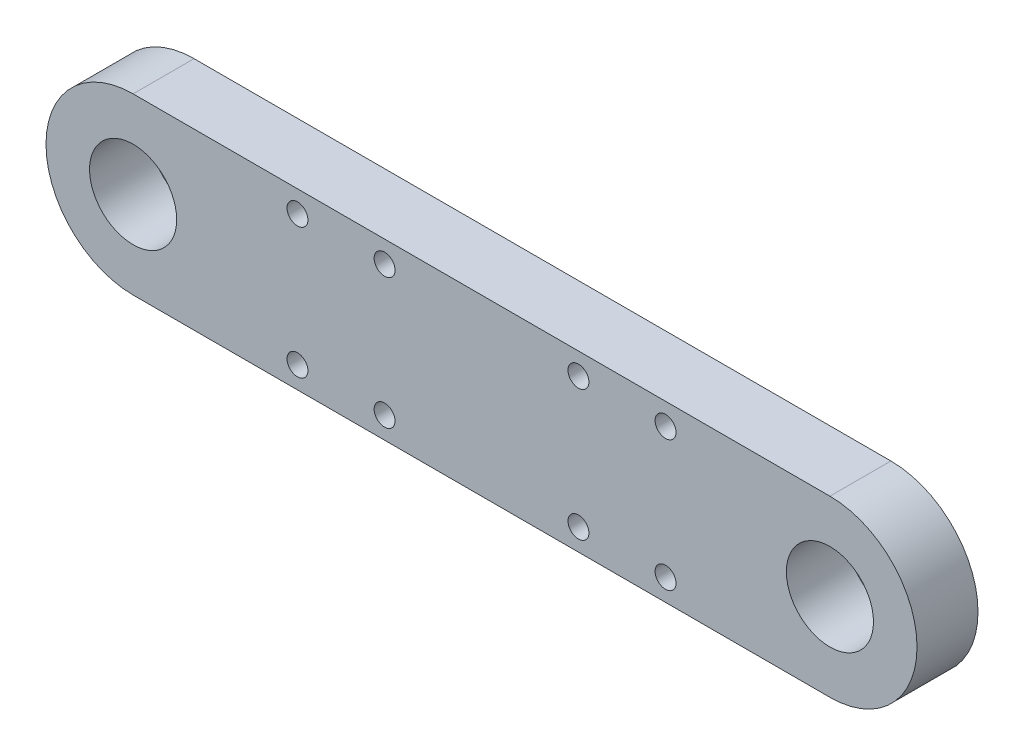
ISO-10303-21;
HEADER;
FILE_DESCRIPTION(('STEP AP214'),'2;1');
FILE_NAME('part.step','',(''),(''),'','','');
FILE_SCHEMA(('AUTOMOTIVE_DESIGN { 1 0 10303 214 1 1 1 1 }'));
ENDSEC;
DATA;
#1=APPLICATION_CONTEXT('core data for automotive mechanical design processes');
#2=APPLICATION_PROTOCOL_DEFINITION('international standard','automotive_design',2000,#1);
#3=PRODUCT_CONTEXT('',#1,'mechanical');
#4=PRODUCT('Part','Part','',(#3));
#5=PRODUCT_RELATED_PRODUCT_CATEGORY('part','',(#4));
#6=PRODUCT_DEFINITION_FORMATION('','',#4);
#7=PRODUCT_DEFINITION_CONTEXT('part definition',#1,'design');
#8=PRODUCT_DEFINITION('design','',#6,#7);
#9=PRODUCT_DEFINITION_SHAPE('','',#8);
#10=(LENGTH_UNIT() NAMED_UNIT(*) SI_UNIT(.MILLI.,.METRE.));
#11=(NAMED_UNIT(*) PLANE_ANGLE_UNIT() SI_UNIT($,.RADIAN.));
#12=(NAMED_UNIT(*) SI_UNIT($,.STERADIAN.) SOLID_ANGLE_UNIT());
#13=UNCERTAINTY_MEASURE_WITH_UNIT(LENGTH_MEASURE(1.E-05),#10,'distance_accuracy_value','');
#14=(GEOMETRIC_REPRESENTATION_CONTEXT(3) GLOBAL_UNCERTAINTY_ASSIGNED_CONTEXT((#13)) GLOBAL_UNIT_ASSIGNED_CONTEXT((#10,
#11,#12)) REPRESENTATION_CONTEXT('',''));
#15=CARTESIAN_POINT('',(0.,0.,0.));
#16=DIRECTION('',(0.,0.,1.));
#17=DIRECTION('',(1.,0.,0.));
#18=AXIS2_PLACEMENT_3D('',#15,#16,#17);
#19=CARTESIAN_POINT('',(0.,0.,7.));
#20=DIRECTION('',(0.,0.,-1.));
#21=DIRECTION('',(-1.,0.,0.));
#22=AXIS2_PLACEMENT_3D('',#19,#20,#21);
#23=CYLINDRICAL_SURFACE('',#22,10.);
#24=CARTESIAN_POINT('',(0.,0.,0.));
#25=DIRECTION('',(0.,0.,1.));
#26=DIRECTION('',(1.,0.,0.));
#27=AXIS2_PLACEMENT_3D('',#24,#25,#26);
#28=CIRCLE('',#27,10.);
#29=CARTESIAN_POINT('',(0.,10.,0.));
#30=VERTEX_POINT('',#29);
#31=CARTESIAN_POINT('',(0.,-10.,0.));
#32=VERTEX_POINT('',#31);
#33=EDGE_CURVE('E112',#30,#32,#28,.T.);
#34=ORIENTED_EDGE('',*,*,#33,.T.);
#35=DIRECTION('',(0.,0.,-1.));
#36=VECTOR('',#35,1.);
#37=CARTESIAN_POINT('',(0.,-10.,7.));
#38=LINE('',#37,#36);
#39=CARTESIAN_POINT('',(0.,-10.,7.));
#40=VERTEX_POINT('',#39);
#41=EDGE_CURVE('E11',#40,#32,#38,.T.);
#42=ORIENTED_EDGE('',*,*,#41,.F.);
#43=CARTESIAN_POINT('',(0.,0.,7.));
#44=DIRECTION('',(0.,0.,1.));
#45=DIRECTION('',(1.,0.,0.));
#46=AXIS2_PLACEMENT_3D('',#43,#44,#45);
#47=CIRCLE('',#46,10.);
#48=CARTESIAN_POINT('',(0.,10.,7.));
#49=VERTEX_POINT('',#48);
#50=EDGE_CURVE('E94',#49,#40,#47,.T.);
#51=ORIENTED_EDGE('',*,*,#50,.F.);
#52=DIRECTION('',(0.,0.,-1.));
#53=VECTOR('',#52,1.);
#54=CARTESIAN_POINT('',(0.,10.,7.));
#55=LINE('',#54,#53);
#56=EDGE_CURVE('E61',#49,#30,#55,.T.);
#57=ORIENTED_EDGE('',*,*,#56,.T.);
#58=EDGE_LOOP('',(#34,#42,#51,#57));
#59=FACE_BOUND('',#58,.T.);
#60=ADVANCED_FACE('F42',(#59),#23,.T.);
#61=CARTESIAN_POINT('',(0.,-10.,7.));
#62=DIRECTION('',(0.,1.,0.));
#63=DIRECTION('',(0.,0.,1.));
#64=AXIS2_PLACEMENT_3D('',#61,#62,#63);
#65=PLANE('',#64);
#66=DIRECTION('',(1.,0.,0.));
#67=VECTOR('',#66,1.);
#68=CARTESIAN_POINT('',(0.,-10.,0.));
#69=LINE('',#68,#67);
#70=CARTESIAN_POINT('',(80.,-10.,0.));
#71=VERTEX_POINT('',#70);
#72=EDGE_CURVE('E99',#32,#71,#69,.T.);
#73=ORIENTED_EDGE('',*,*,#72,.T.);
#74=DIRECTION('',(0.,0.,-1.));
#75=VECTOR('',#74,1.);
#76=CARTESIAN_POINT('',(80.,-10.,7.));
#77=LINE('',#76,#75);
#78=CARTESIAN_POINT('',(80.,-10.,7.));
#79=VERTEX_POINT('',#78);
#80=EDGE_CURVE('E52',#79,#71,#77,.T.);
#81=ORIENTED_EDGE('',*,*,#80,.F.);
#82=DIRECTION('',(1.,0.,0.));
#83=VECTOR('',#82,1.);
#84=CARTESIAN_POINT('',(0.,-10.,7.));
#85=LINE('',#84,#83);
#86=EDGE_CURVE('E87',#40,#79,#85,.T.);
#87=ORIENTED_EDGE('',*,*,#86,.F.);
#88=ORIENTED_EDGE('',*,*,#41,.T.);
#89=EDGE_LOOP('',(#73,#81,#87,#88));
#90=FACE_BOUND('',#89,.T.);
#91=ADVANCED_FACE('F98',(#90),#65,.F.);
#92=CARTESIAN_POINT('',(80.,0.,7.));
#93=DIRECTION('',(0.,0.,-1.));
#94=DIRECTION('',(-1.,0.,0.));
#95=AXIS2_PLACEMENT_3D('',#92,#93,#94);
#96=CYLINDRICAL_SURFACE('',#95,10.);
#97=CARTESIAN_POINT('',(80.,0.,0.));
#98=DIRECTION('',(0.,0.,1.));
#99=DIRECTION('',(1.,0.,0.));
#100=AXIS2_PLACEMENT_3D('',#97,#98,#99);
#101=CIRCLE('',#100,10.);
#102=CARTESIAN_POINT('',(80.,10.,0.));
#103=VERTEX_POINT('',#102);
#104=EDGE_CURVE('E116',#71,#103,#101,.T.);
#105=ORIENTED_EDGE('',*,*,#104,.T.);
#106=DIRECTION('',(0.,0.,-1.));
#107=VECTOR('',#106,1.);
#108=CARTESIAN_POINT('',(80.,10.,7.));
#109=LINE('',#108,#107);
#110=CARTESIAN_POINT('',(80.,10.,7.));
#111=VERTEX_POINT('',#110);
#112=EDGE_CURVE('E76',#111,#103,#109,.T.);
#113=ORIENTED_EDGE('',*,*,#112,.F.);
#114=CARTESIAN_POINT('',(80.,0.,7.));
#115=DIRECTION('',(0.,0.,1.));
#116=DIRECTION('',(1.,0.,0.));
#117=AXIS2_PLACEMENT_3D('',#114,#115,#116);
#118=CIRCLE('',#117,10.);
#119=EDGE_CURVE('E93',#79,#111,#118,.T.);
#120=ORIENTED_EDGE('',*,*,#119,.F.);
#121=ORIENTED_EDGE('',*,*,#80,.T.);
#122=EDGE_LOOP('',(#105,#113,#120,#121));
#123=FACE_BOUND('',#122,.T.);
#124=ADVANCED_FACE('F103',(#123),#96,.T.);
#125=CARTESIAN_POINT('',(0.,0.,7.));
#126=DIRECTION('',(0.,0.,-1.));
#127=DIRECTION('',(-1.,0.,0.));
#128=AXIS2_PLACEMENT_3D('',#125,#126,#127);
#129=CYLINDRICAL_SURFACE('',#128,5.);
#130=CARTESIAN_POINT('',(0.,0.,7.));
#131=DIRECTION('',(0.,0.,1.));
#132=DIRECTION('',(1.,0.,0.));
#133=AXIS2_PLACEMENT_3D('',#130,#131,#132);
#134=CIRCLE('',#133,5.);
#135=CARTESIAN_POINT('',(5.,0.,7.));
#136=VERTEX_POINT('',#135);
#137=EDGE_CURVE('E121',#136,#136,#134,.T.);
#138=ORIENTED_EDGE('',*,*,#137,.T.);
#139=EDGE_LOOP('',(#138));
#140=FACE_BOUND('',#139,.T.);
#141=CARTESIAN_POINT('',(0.,0.,0.));
#142=DIRECTION('',(0.,0.,1.));
#143=DIRECTION('',(1.,0.,0.));
#144=AXIS2_PLACEMENT_3D('',#141,#142,#143);
#145=CIRCLE('',#144,5.);
#146=CARTESIAN_POINT('',(5.,0.,0.));
#147=VERTEX_POINT('',#146);
#148=EDGE_CURVE('E109',#147,#147,#145,.T.);
#149=ORIENTED_EDGE('',*,*,#148,.F.);
#150=EDGE_LOOP('',(#149));
#151=FACE_BOUND('',#150,.T.);
#152=ADVANCED_FACE('F44',(#140,#151),#129,.F.);
#153=CARTESIAN_POINT('',(0.,10.,7.));
#154=DIRECTION('',(0.,1.,0.));
#155=DIRECTION('',(0.,0.,1.));
#156=AXIS2_PLACEMENT_3D('',#153,#154,#155);
#157=PLANE('',#156);
#158=DIRECTION('',(1.,0.,0.));
#159=VECTOR('',#158,1.);
#160=CARTESIAN_POINT('',(0.,10.,0.));
#161=LINE('',#160,#159);
#162=EDGE_CURVE('E118',#30,#103,#161,.T.);
#163=ORIENTED_EDGE('',*,*,#162,.F.);
#164=ORIENTED_EDGE('',*,*,#56,.F.);
#165=DIRECTION('',(1.,0.,0.));
#166=VECTOR('',#165,1.);
#167=CARTESIAN_POINT('',(0.,10.,7.));
#168=LINE('',#167,#166);
#169=EDGE_CURVE('E104',#49,#111,#168,.T.);
#170=ORIENTED_EDGE('',*,*,#169,.T.);
#171=ORIENTED_EDGE('',*,*,#112,.T.);
#172=EDGE_LOOP('',(#163,#164,#170,#171));
#173=FACE_BOUND('',#172,.T.);
#174=ADVANCED_FACE('F178',(#173),#157,.T.);
#175=CARTESIAN_POINT('',(0.,0.,7.));
#176=DIRECTION('',(0.,0.,1.));
#177=DIRECTION('',(1.,0.,0.));
#178=AXIS2_PLACEMENT_3D('',#175,#176,#177);
#179=PLANE('',#178);
#180=CARTESIAN_POINT('',(28.870961846573,7.49999999999295,7.));
#181=DIRECTION('',(0.,0.,1.));
#182=DIRECTION('',(-1.,0.,0.));
#183=AXIS2_PLACEMENT_3D('',#180,#181,#182);
#184=CIRCLE('',#183,1.2);
#185=CARTESIAN_POINT('',(27.670961846573,7.49999999999295,7.));
#186=VERTEX_POINT('',#185);
#187=EDGE_CURVE('E133',#186,#186,#184,.T.);
#188=ORIENTED_EDGE('',*,*,#187,.F.);
#189=EDGE_LOOP('',(#188));
#190=FACE_BOUND('',#189,.T.);
#191=CARTESIAN_POINT('',(28.870961846573,-7.50000000000705,7.));
#192=DIRECTION('',(0.,0.,1.));
#193=DIRECTION('',(-1.,0.,0.));
#194=AXIS2_PLACEMENT_3D('',#191,#192,#193);
#195=CIRCLE('',#194,1.20000000000001);
#196=CARTESIAN_POINT('',(27.670961846573,-7.50000000000705,7.));
#197=VERTEX_POINT('',#196);
#198=EDGE_CURVE('E396',#197,#197,#195,.T.);
#199=ORIENTED_EDGE('',*,*,#198,.F.);
#200=EDGE_LOOP('',(#199));
#201=FACE_BOUND('',#200,.T.);
#202=CARTESIAN_POINT('',(18.870961846573,-7.50000000000706,7.));
#203=DIRECTION('',(0.,0.,1.));
#204=DIRECTION('',(-1.,0.,0.));
#205=AXIS2_PLACEMENT_3D('',#202,#203,#204);
#206=CIRCLE('',#205,1.2);
#207=CARTESIAN_POINT('',(17.670961846573,-7.50000000000706,7.));
#208=VERTEX_POINT('',#207);
#209=EDGE_CURVE('E398',#208,#208,#206,.T.);
#210=ORIENTED_EDGE('',*,*,#209,.F.);
#211=EDGE_LOOP('',(#210));
#212=FACE_BOUND('',#211,.T.);
#213=CARTESIAN_POINT('',(18.870961846573,7.49999999999294,7.));
#214=DIRECTION('',(0.,0.,1.));
#215=DIRECTION('',(-1.,0.,0.));
#216=AXIS2_PLACEMENT_3D('',#213,#214,#215);
#217=CIRCLE('',#216,1.2);
#218=CARTESIAN_POINT('',(17.670961846573,7.49999999999294,7.));
#219=VERTEX_POINT('',#218);
#220=EDGE_CURVE('E402',#219,#219,#217,.T.);
#221=ORIENTED_EDGE('',*,*,#220,.F.);
#222=EDGE_LOOP('',(#221));
#223=FACE_BOUND('',#222,.T.);
#224=CARTESIAN_POINT('',(80.,0.,7.));
#225=DIRECTION('',(0.,0.,1.));
#226=DIRECTION('',(-1.,0.,0.));
#227=AXIS2_PLACEMENT_3D('',#224,#225,#226);
#228=CIRCLE('',#227,5.);
#229=CARTESIAN_POINT('',(75.,0.,7.));
#230=VERTEX_POINT('',#229);
#231=EDGE_CURVE('E128',#230,#230,#228,.T.);
#232=ORIENTED_EDGE('',*,*,#231,.F.);
#233=EDGE_LOOP('',(#232));
#234=FACE_BOUND('',#233,.T.);
#235=CARTESIAN_POINT('',(51.129038153427,7.49999999999295,7.));
#236=DIRECTION('',(0.,0.,1.));
#237=DIRECTION('',(1.,0.,0.));
#238=AXIS2_PLACEMENT_3D('',#235,#236,#237);
#239=CIRCLE('',#238,1.19999999999999);
#240=CARTESIAN_POINT('',(52.329038153427,7.49999999999295,7.));
#241=VERTEX_POINT('',#240);
#242=EDGE_CURVE('E113',#241,#241,#239,.T.);
#243=ORIENTED_EDGE('',*,*,#242,.F.);
#244=EDGE_LOOP('',(#243));
#245=FACE_BOUND('',#244,.T.);
#246=CARTESIAN_POINT('',(61.129038153427,7.49999999999295,7.));
#247=DIRECTION('',(0.,0.,1.));
#248=DIRECTION('',(1.,0.,0.));
#249=AXIS2_PLACEMENT_3D('',#246,#247,#248);
#250=CIRCLE('',#249,1.2);
#251=CARTESIAN_POINT('',(62.329038153427,7.49999999999295,7.));
#252=VERTEX_POINT('',#251);
#253=EDGE_CURVE('E166',#252,#252,#250,.T.);
#254=ORIENTED_EDGE('',*,*,#253,.F.);
#255=EDGE_LOOP('',(#254));
#256=FACE_BOUND('',#255,.T.);
#257=CARTESIAN_POINT('',(61.129038153427,-7.50000000000705,7.));
#258=DIRECTION('',(0.,0.,1.));
#259=DIRECTION('',(1.,0.,0.));
#260=AXIS2_PLACEMENT_3D('',#257,#258,#259);
#261=CIRCLE('',#260,1.2);
#262=CARTESIAN_POINT('',(62.329038153427,-7.50000000000705,7.));
#263=VERTEX_POINT('',#262);
#264=EDGE_CURVE('E163',#263,#263,#261,.T.);
#265=ORIENTED_EDGE('',*,*,#264,.F.);
#266=EDGE_LOOP('',(#265));
#267=FACE_BOUND('',#266,.T.);
#268=CARTESIAN_POINT('',(51.129038153427,-7.50000000000705,7.));
#269=DIRECTION('',(0.,0.,1.));
#270=DIRECTION('',(1.,0.,0.));
#271=AXIS2_PLACEMENT_3D('',#268,#269,#270);
#272=CIRCLE('',#271,1.20000000000001);
#273=CARTESIAN_POINT('',(52.329038153427,-7.50000000000705,7.));
#274=VERTEX_POINT('',#273);
#275=EDGE_CURVE('E160',#274,#274,#272,.T.);
#276=ORIENTED_EDGE('',*,*,#275,.F.);
#277=EDGE_LOOP('',(#276));
#278=FACE_BOUND('',#277,.T.);
#279=ORIENTED_EDGE('',*,*,#137,.F.);
#280=EDGE_LOOP('',(#279));
#281=FACE_BOUND('',#280,.T.);
#282=ORIENTED_EDGE('',*,*,#50,.T.);
#283=ORIENTED_EDGE('',*,*,#86,.T.);
#284=ORIENTED_EDGE('',*,*,#119,.T.);
#285=ORIENTED_EDGE('',*,*,#169,.F.);
#286=EDGE_LOOP('',(#282,#283,#284,#285));
#287=FACE_BOUND('',#286,.T.);
#288=ADVANCED_FACE('F90',(#190,#201,#212,#223,#234,#245,#256,#267,#278,#281,#287),#179,.T.);
#289=CARTESIAN_POINT('',(0.,0.,0.));
#290=DIRECTION('',(0.,0.,1.));
#291=DIRECTION('',(1.,0.,0.));
#292=AXIS2_PLACEMENT_3D('',#289,#290,#291);
#293=PLANE('',#292);
#294=CARTESIAN_POINT('',(28.870961846573,7.49999999999295,0.));
#295=DIRECTION('',(0.,0.,1.));
#296=DIRECTION('',(1.,0.,0.));
#297=AXIS2_PLACEMENT_3D('',#294,#295,#296);
#298=CIRCLE('',#297,1.2);
#299=CARTESIAN_POINT('',(30.070961846573,7.49999999999295,0.));
#300=VERTEX_POINT('',#299);
#301=EDGE_CURVE('E46',#300,#300,#298,.T.);
#302=ORIENTED_EDGE('',*,*,#301,.T.);
#303=EDGE_LOOP('',(#302));
#304=FACE_BOUND('',#303,.T.);
#305=CARTESIAN_POINT('',(28.870961846573,-7.50000000000705,0.));
#306=DIRECTION('',(0.,0.,1.));
#307=DIRECTION('',(1.,0.,0.));
#308=AXIS2_PLACEMENT_3D('',#305,#306,#307);
#309=CIRCLE('',#308,1.20000000000001);
#310=CARTESIAN_POINT('',(30.070961846573,-7.50000000000705,0.));
#311=VERTEX_POINT('',#310);
#312=EDGE_CURVE('E135',#311,#311,#309,.T.);
#313=ORIENTED_EDGE('',*,*,#312,.T.);
#314=EDGE_LOOP('',(#313));
#315=FACE_BOUND('',#314,.T.);
#316=CARTESIAN_POINT('',(18.870961846573,-7.50000000000706,0.));
#317=DIRECTION('',(0.,0.,1.));
#318=DIRECTION('',(1.,0.,0.));
#319=AXIS2_PLACEMENT_3D('',#316,#317,#318);
#320=CIRCLE('',#319,1.2);
#321=CARTESIAN_POINT('',(20.070961846573,-7.50000000000706,0.));
#322=VERTEX_POINT('',#321);
#323=EDGE_CURVE('E132',#322,#322,#320,.T.);
#324=ORIENTED_EDGE('',*,*,#323,.T.);
#325=EDGE_LOOP('',(#324));
#326=FACE_BOUND('',#325,.T.);
#327=CARTESIAN_POINT('',(18.870961846573,7.49999999999294,0.));
#328=DIRECTION('',(0.,0.,1.));
#329=DIRECTION('',(1.,0.,0.));
#330=AXIS2_PLACEMENT_3D('',#327,#328,#329);
#331=CIRCLE('',#330,1.2);
#332=CARTESIAN_POINT('',(20.070961846573,7.49999999999294,0.));
#333=VERTEX_POINT('',#332);
#334=EDGE_CURVE('E129',#333,#333,#331,.T.);
#335=ORIENTED_EDGE('',*,*,#334,.T.);
#336=EDGE_LOOP('',(#335));
#337=FACE_BOUND('',#336,.T.);
#338=CARTESIAN_POINT('',(80.,0.,0.));
#339=DIRECTION('',(0.,0.,1.));
#340=DIRECTION('',(1.,0.,0.));
#341=AXIS2_PLACEMENT_3D('',#338,#339,#340);
#342=CIRCLE('',#341,5.);
#343=CARTESIAN_POINT('',(85.,0.,0.));
#344=VERTEX_POINT('',#343);
#345=EDGE_CURVE('E124',#344,#344,#342,.T.);
#346=ORIENTED_EDGE('',*,*,#345,.T.);
#347=EDGE_LOOP('',(#346));
#348=FACE_BOUND('',#347,.T.);
#349=CARTESIAN_POINT('',(51.129038153427,7.49999999999295,0.));
#350=DIRECTION('',(0.,0.,-1.));
#351=DIRECTION('',(-1.,0.,0.));
#352=AXIS2_PLACEMENT_3D('',#349,#350,#351);
#353=CIRCLE('',#352,1.19999999999999);
#354=CARTESIAN_POINT('',(49.929038153427,7.49999999999295,0.));
#355=VERTEX_POINT('',#354);
#356=EDGE_CURVE('E127',#355,#355,#353,.T.);
#357=ORIENTED_EDGE('',*,*,#356,.F.);
#358=EDGE_LOOP('',(#357));
#359=FACE_BOUND('',#358,.T.);
#360=CARTESIAN_POINT('',(61.129038153427,7.49999999999295,0.));
#361=DIRECTION('',(0.,0.,-1.));
#362=DIRECTION('',(-1.,0.,0.));
#363=AXIS2_PLACEMENT_3D('',#360,#361,#362);
#364=CIRCLE('',#363,1.2);
#365=CARTESIAN_POINT('',(59.929038153427,7.49999999999295,0.));
#366=VERTEX_POINT('',#365);
#367=EDGE_CURVE('E153',#366,#366,#364,.T.);
#368=ORIENTED_EDGE('',*,*,#367,.F.);
#369=EDGE_LOOP('',(#368));
#370=FACE_BOUND('',#369,.T.);
#371=CARTESIAN_POINT('',(61.129038153427,-7.50000000000705,0.));
#372=DIRECTION('',(0.,0.,-1.));
#373=DIRECTION('',(-1.,0.,0.));
#374=AXIS2_PLACEMENT_3D('',#371,#372,#373);
#375=CIRCLE('',#374,1.2);
#376=CARTESIAN_POINT('',(59.929038153427,-7.50000000000705,0.));
#377=VERTEX_POINT('',#376);
#378=EDGE_CURVE('E149',#377,#377,#375,.T.);
#379=ORIENTED_EDGE('',*,*,#378,.F.);
#380=EDGE_LOOP('',(#379));
#381=FACE_BOUND('',#380,.T.);
#382=CARTESIAN_POINT('',(51.129038153427,-7.50000000000705,0.));
#383=DIRECTION('',(0.,0.,-1.));
#384=DIRECTION('',(-1.,0.,0.));
#385=AXIS2_PLACEMENT_3D('',#382,#383,#384);
#386=CIRCLE('',#385,1.20000000000001);
#387=CARTESIAN_POINT('',(49.929038153427,-7.50000000000705,0.));
#388=VERTEX_POINT('',#387);
#389=EDGE_CURVE('E152',#388,#388,#386,.T.);
#390=ORIENTED_EDGE('',*,*,#389,.F.);
#391=EDGE_LOOP('',(#390));
#392=FACE_BOUND('',#391,.T.);
#393=ORIENTED_EDGE('',*,*,#148,.T.);
#394=EDGE_LOOP('',(#393));
#395=FACE_BOUND('',#394,.T.);
#396=ORIENTED_EDGE('',*,*,#33,.F.);
#397=ORIENTED_EDGE('',*,*,#162,.T.);
#398=ORIENTED_EDGE('',*,*,#104,.F.);
#399=ORIENTED_EDGE('',*,*,#72,.F.);
#400=EDGE_LOOP('',(#396,#397,#398,#399));
#401=FACE_BOUND('',#400,.T.);
#402=ADVANCED_FACE('F177',(#304,#315,#326,#337,#348,#359,#370,#381,#392,#395,#401),#293,.F.);
#403=CARTESIAN_POINT('',(51.129038153427,-7.50000000000705,10.));
#404=DIRECTION('',(0.,0.,-1.));
#405=DIRECTION('',(-1.,0.,0.));
#406=AXIS2_PLACEMENT_3D('',#403,#404,#405);
#407=CYLINDRICAL_SURFACE('',#406,1.20000000000001);
#408=ORIENTED_EDGE('',*,*,#275,.T.);
#409=EDGE_LOOP('',(#408));
#410=FACE_BOUND('',#409,.T.);
#411=ORIENTED_EDGE('',*,*,#389,.T.);
#412=EDGE_LOOP('',(#411));
#413=FACE_BOUND('',#412,.T.);
#414=ADVANCED_FACE('F185',(#410,#413),#407,.F.);
#415=CARTESIAN_POINT('',(61.129038153427,-7.50000000000705,10.));
#416=DIRECTION('',(0.,0.,-1.));
#417=DIRECTION('',(-1.,0.,0.));
#418=AXIS2_PLACEMENT_3D('',#415,#416,#417);
#419=CYLINDRICAL_SURFACE('',#418,1.2);
#420=ORIENTED_EDGE('',*,*,#264,.T.);
#421=EDGE_LOOP('',(#420));
#422=FACE_BOUND('',#421,.T.);
#423=ORIENTED_EDGE('',*,*,#378,.T.);
#424=EDGE_LOOP('',(#423));
#425=FACE_BOUND('',#424,.T.);
#426=ADVANCED_FACE('F228',(#422,#425),#419,.F.);
#427=CARTESIAN_POINT('',(61.129038153427,7.49999999999295,10.));
#428=DIRECTION('',(0.,0.,-1.));
#429=DIRECTION('',(-1.,0.,0.));
#430=AXIS2_PLACEMENT_3D('',#427,#428,#429);
#431=CYLINDRICAL_SURFACE('',#430,1.2);
#432=ORIENTED_EDGE('',*,*,#253,.T.);
#433=EDGE_LOOP('',(#432));
#434=FACE_BOUND('',#433,.T.);
#435=ORIENTED_EDGE('',*,*,#367,.T.);
#436=EDGE_LOOP('',(#435));
#437=FACE_BOUND('',#436,.T.);
#438=ADVANCED_FACE('F237',(#434,#437),#431,.F.);
#439=CARTESIAN_POINT('',(51.129038153427,7.49999999999295,10.));
#440=DIRECTION('',(0.,0.,-1.));
#441=DIRECTION('',(-1.,0.,0.));
#442=AXIS2_PLACEMENT_3D('',#439,#440,#441);
#443=CYLINDRICAL_SURFACE('',#442,1.19999999999999);
#444=ORIENTED_EDGE('',*,*,#242,.T.);
#445=EDGE_LOOP('',(#444));
#446=FACE_BOUND('',#445,.T.);
#447=ORIENTED_EDGE('',*,*,#356,.T.);
#448=EDGE_LOOP('',(#447));
#449=FACE_BOUND('',#448,.T.);
#450=ADVANCED_FACE('F247',(#446,#449),#443,.F.);
#451=CARTESIAN_POINT('',(80.,0.,-3.));
#452=DIRECTION('',(0.,0.,1.));
#453=DIRECTION('',(1.,0.,0.));
#454=AXIS2_PLACEMENT_3D('',#451,#452,#453);
#455=CYLINDRICAL_SURFACE('',#454,5.);
#456=ORIENTED_EDGE('',*,*,#231,.T.);
#457=EDGE_LOOP('',(#456));
#458=FACE_BOUND('',#457,.T.);
#459=ORIENTED_EDGE('',*,*,#345,.F.);
#460=EDGE_LOOP('',(#459));
#461=FACE_BOUND('',#460,.T.);
#462=ADVANCED_FACE('F257',(#458,#461),#455,.F.);
#463=CARTESIAN_POINT('',(18.870961846573,7.49999999999294,-3.));
#464=DIRECTION('',(0.,0.,1.));
#465=DIRECTION('',(1.,0.,0.));
#466=AXIS2_PLACEMENT_3D('',#463,#464,#465);
#467=CYLINDRICAL_SURFACE('',#466,1.2);
#468=ORIENTED_EDGE('',*,*,#220,.T.);
#469=EDGE_LOOP('',(#468));
#470=FACE_BOUND('',#469,.T.);
#471=ORIENTED_EDGE('',*,*,#334,.F.);
#472=EDGE_LOOP('',(#471));
#473=FACE_BOUND('',#472,.T.);
#474=ADVANCED_FACE('F266',(#470,#473),#467,.F.);
#475=CARTESIAN_POINT('',(18.870961846573,-7.50000000000706,-3.));
#476=DIRECTION('',(0.,0.,1.));
#477=DIRECTION('',(1.,0.,0.));
#478=AXIS2_PLACEMENT_3D('',#475,#476,#477);
#479=CYLINDRICAL_SURFACE('',#478,1.2);
#480=ORIENTED_EDGE('',*,*,#209,.T.);
#481=EDGE_LOOP('',(#480));
#482=FACE_BOUND('',#481,.T.);
#483=ORIENTED_EDGE('',*,*,#323,.F.);
#484=EDGE_LOOP('',(#483));
#485=FACE_BOUND('',#484,.T.);
#486=ADVANCED_FACE('F274',(#482,#485),#479,.F.);
#487=CARTESIAN_POINT('',(28.870961846573,-7.50000000000705,-3.));
#488=DIRECTION('',(0.,0.,1.));
#489=DIRECTION('',(1.,0.,0.));
#490=AXIS2_PLACEMENT_3D('',#487,#488,#489);
#491=CYLINDRICAL_SURFACE('',#490,1.20000000000001);
#492=ORIENTED_EDGE('',*,*,#198,.T.);
#493=EDGE_LOOP('',(#492));
#494=FACE_BOUND('',#493,.T.);
#495=ORIENTED_EDGE('',*,*,#312,.F.);
#496=EDGE_LOOP('',(#495));
#497=FACE_BOUND('',#496,.T.);
#498=ADVANCED_FACE('F284',(#494,#497),#491,.F.);
#499=CARTESIAN_POINT('',(28.870961846573,7.49999999999295,-3.));
#500=DIRECTION('',(0.,0.,1.));
#501=DIRECTION('',(1.,0.,0.));
#502=AXIS2_PLACEMENT_3D('',#499,#500,#501);
#503=CYLINDRICAL_SURFACE('',#502,1.2);
#504=ORIENTED_EDGE('',*,*,#187,.T.);
#505=EDGE_LOOP('',(#504));
#506=FACE_BOUND('',#505,.T.);
#507=ORIENTED_EDGE('',*,*,#301,.F.);
#508=EDGE_LOOP('',(#507));
#509=FACE_BOUND('',#508,.T.);
#510=ADVANCED_FACE('F294',(#506,#509),#503,.F.);
#511=CLOSED_SHELL('',(#60,#91,#124,#152,#174,#288,#402,#414,#426,#438,#450,#462,#474,#486,#498,#510));
#512=MANIFOLD_SOLID_BREP('B2',#511);
#513=ADVANCED_BREP_SHAPE_REPRESENTATION('',(#18,#512),#14);
#514=SHAPE_DEFINITION_REPRESENTATION(#9,#513);
ENDSEC;
END-ISO-10303-21;
